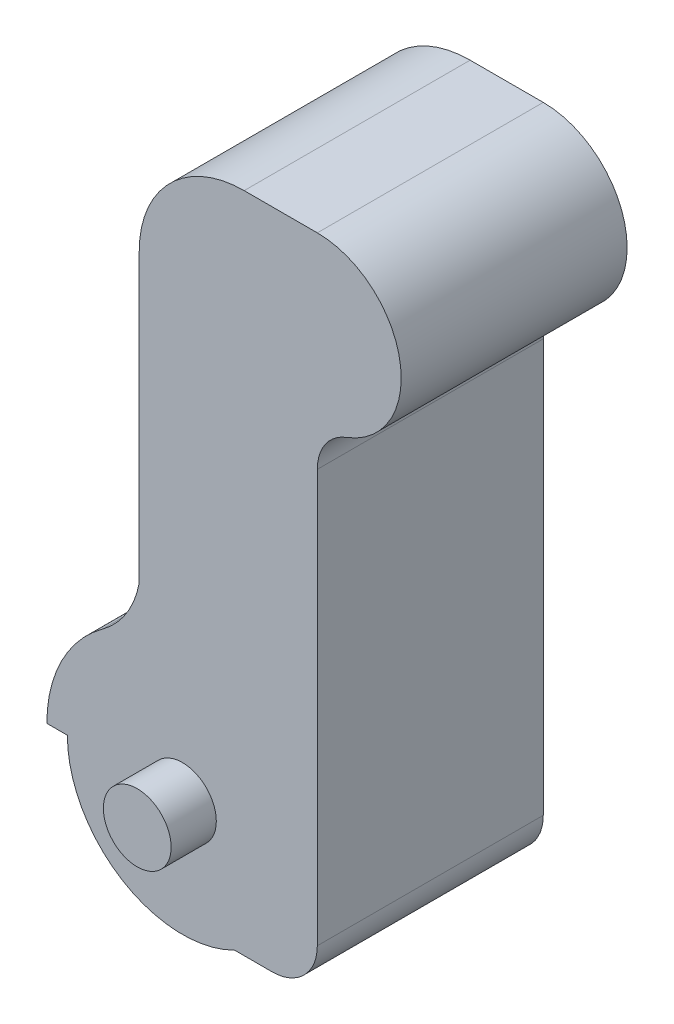
ISO-10303-21;
HEADER;
FILE_DESCRIPTION(('STEP AP214'),'2;1');
FILE_NAME('part.step','',(''),(''),'','','');
FILE_SCHEMA(('AUTOMOTIVE_DESIGN { 1 0 10303 214 1 1 1 1 }'));
ENDSEC;
DATA;
#1=APPLICATION_CONTEXT('core data for automotive mechanical design processes');
#2=APPLICATION_PROTOCOL_DEFINITION('international standard','automotive_design',2000,#1);
#3=PRODUCT_CONTEXT('',#1,'mechanical');
#4=PRODUCT('Part','Part','',(#3));
#5=PRODUCT_RELATED_PRODUCT_CATEGORY('part','',(#4));
#6=PRODUCT_DEFINITION_FORMATION('','',#4);
#7=PRODUCT_DEFINITION_CONTEXT('part definition',#1,'design');
#8=PRODUCT_DEFINITION('design','',#6,#7);
#9=PRODUCT_DEFINITION_SHAPE('','',#8);
#10=(LENGTH_UNIT() NAMED_UNIT(*) SI_UNIT(.MILLI.,.METRE.));
#11=(NAMED_UNIT(*) PLANE_ANGLE_UNIT() SI_UNIT($,.RADIAN.));
#12=(NAMED_UNIT(*) SI_UNIT($,.STERADIAN.) SOLID_ANGLE_UNIT());
#13=UNCERTAINTY_MEASURE_WITH_UNIT(LENGTH_MEASURE(1.E-05),#10,'distance_accuracy_value','');
#14=(GEOMETRIC_REPRESENTATION_CONTEXT(3) GLOBAL_UNCERTAINTY_ASSIGNED_CONTEXT((#13)) GLOBAL_UNIT_ASSIGNED_CONTEXT((#10,
#11,#12)) REPRESENTATION_CONTEXT('',''));
#15=CARTESIAN_POINT('',(0.,0.,0.));
#16=DIRECTION('',(0.,0.,1.));
#17=DIRECTION('',(1.,0.,0.));
#18=AXIS2_PLACEMENT_3D('',#15,#16,#17);
#19=CARTESIAN_POINT('',(13.7663728409148,-12.4324964955587,10.));
#20=DIRECTION('',(0.,0.,-1.));
#21=DIRECTION('',(-1.,0.,0.));
#22=AXIS2_PLACEMENT_3D('',#19,#20,#21);
#23=CYLINDRICAL_SURFACE('',#22,2.);
#24=CARTESIAN_POINT('',(13.7663728409148,-12.4324964955587,0.));
#25=DIRECTION('',(0.,0.,1.));
#26=DIRECTION('',(-1.,0.,0.));
#27=AXIS2_PLACEMENT_3D('',#24,#25,#26);
#28=CIRCLE('',#27,2.);
#29=CARTESIAN_POINT('',(13.7663728408997,-14.4324964955587,0.));
#30=VERTEX_POINT('',#29);
#31=CARTESIAN_POINT('',(15.7663728409148,-12.4324964955587,0.));
#32=VERTEX_POINT('',#31);
#33=EDGE_CURVE('E154',#30,#32,#28,.T.);
#34=ORIENTED_EDGE('',*,*,#33,.T.);
#35=DIRECTION('',(0.,0.,-1.));
#36=VECTOR('',#35,1.);
#37=CARTESIAN_POINT('',(15.7663728409148,-12.4324964955587,10.));
#38=LINE('',#37,#36);
#39=CARTESIAN_POINT('',(15.7663728409148,-12.4324964955587,10.));
#40=VERTEX_POINT('',#39);
#41=EDGE_CURVE('E35',#40,#32,#38,.T.);
#42=ORIENTED_EDGE('',*,*,#41,.F.);
#43=CARTESIAN_POINT('',(13.7663728409148,-12.4324964955587,10.));
#44=DIRECTION('',(0.,0.,1.));
#45=DIRECTION('',(-1.,0.,0.));
#46=AXIS2_PLACEMENT_3D('',#43,#44,#45);
#47=CIRCLE('',#46,2.);
#48=CARTESIAN_POINT('',(13.7663728408997,-14.4324964955587,10.));
#49=VERTEX_POINT('',#48);
#50=EDGE_CURVE('E177',#49,#40,#47,.T.);
#51=ORIENTED_EDGE('',*,*,#50,.F.);
#52=DIRECTION('',(0.,0.,-1.));
#53=VECTOR('',#52,1.);
#54=CARTESIAN_POINT('',(13.7663728408997,-14.4324964955587,10.));
#55=LINE('',#54,#53);
#56=EDGE_CURVE('E150',#49,#30,#55,.T.);
#57=ORIENTED_EDGE('',*,*,#56,.T.);
#58=EDGE_LOOP('',(#34,#42,#51,#57));
#59=FACE_BOUND('',#58,.T.);
#60=ADVANCED_FACE('F32',(#59),#23,.T.);
#61=CARTESIAN_POINT('',(15.7663728409148,5.8287976160783,10.));
#62=DIRECTION('',(-1.,0.,0.));
#63=DIRECTION('',(0.,0.,1.));
#64=AXIS2_PLACEMENT_3D('',#61,#62,#63);
#65=PLANE('',#64);
#66=DIRECTION('',(0.,1.,0.));
#67=VECTOR('',#66,1.);
#68=CARTESIAN_POINT('',(15.7663728409148,5.8287976160783,0.));
#69=LINE('',#68,#67);
#70=CARTESIAN_POINT('',(15.7663728409148,5.8287976160783,0.));
#71=VERTEX_POINT('',#70);
#72=EDGE_CURVE('E157',#32,#71,#69,.T.);
#73=ORIENTED_EDGE('',*,*,#72,.T.);
#74=DIRECTION('',(0.,0.,-1.));
#75=VECTOR('',#74,1.);
#76=CARTESIAN_POINT('',(15.7663728409148,5.8287976160783,10.));
#77=LINE('',#76,#75);
#78=CARTESIAN_POINT('',(15.7663728409148,5.8287976160783,10.));
#79=VERTEX_POINT('',#78);
#80=EDGE_CURVE('E198',#79,#71,#77,.T.);
#81=ORIENTED_EDGE('',*,*,#80,.F.);
#82=DIRECTION('',(0.,1.,0.));
#83=VECTOR('',#82,1.);
#84=CARTESIAN_POINT('',(15.7663728409148,5.8287976160783,10.));
#85=LINE('',#84,#83);
#86=EDGE_CURVE('E105',#40,#79,#85,.T.);
#87=ORIENTED_EDGE('',*,*,#86,.F.);
#88=ORIENTED_EDGE('',*,*,#41,.T.);
#89=EDGE_LOOP('',(#73,#81,#87,#88));
#90=FACE_BOUND('',#89,.T.);
#91=ADVANCED_FACE('F204',(#90),#65,.F.);
#92=CARTESIAN_POINT('',(17.7663728409148,5.8287976160783,10.));
#93=DIRECTION('',(0.,0.,-1.));
#94=DIRECTION('',(-1.,0.,0.));
#95=AXIS2_PLACEMENT_3D('',#92,#93,#94);
#96=CYLINDRICAL_SURFACE('',#95,2.);
#97=CARTESIAN_POINT('',(17.7663728409148,5.8287976160783,0.));
#98=DIRECTION('',(0.,0.,-1.));
#99=DIRECTION('',(-1.,0.,0.));
#100=AXIS2_PLACEMENT_3D('',#97,#98,#99);
#101=CIRCLE('',#100,2.);
#102=CARTESIAN_POINT('',(17.0662093922473,7.70223593776121,0.));
#103=VERTEX_POINT('',#102);
#104=EDGE_CURVE('E160',#71,#103,#101,.T.);
#105=ORIENTED_EDGE('',*,*,#104,.T.);
#106=DIRECTION('',(0.,0.,-1.));
#107=VECTOR('',#106,1.);
#108=CARTESIAN_POINT('',(17.0662093922473,7.70223593776121,10.));
#109=LINE('',#108,#107);
#110=CARTESIAN_POINT('',(17.0662093922473,7.70223593776121,10.));
#111=VERTEX_POINT('',#110);
#112=EDGE_CURVE('E196',#111,#103,#109,.T.);
#113=ORIENTED_EDGE('',*,*,#112,.F.);
#114=CARTESIAN_POINT('',(17.7663728409148,5.8287976160783,10.));
#115=DIRECTION('',(0.,0.,-1.));
#116=DIRECTION('',(-1.,0.,0.));
#117=AXIS2_PLACEMENT_3D('',#114,#115,#116);
#118=CIRCLE('',#117,2.);
#119=EDGE_CURVE('E221',#79,#111,#118,.T.);
#120=ORIENTED_EDGE('',*,*,#119,.F.);
#121=ORIENTED_EDGE('',*,*,#80,.T.);
#122=EDGE_LOOP('',(#105,#113,#120,#121));
#123=FACE_BOUND('',#122,.T.);
#124=ADVANCED_FACE('F213',(#123),#96,.F.);
#125=CARTESIAN_POINT('',(15.7663728409148,11.1802289861344,10.));
#126=DIRECTION('',(0.,0.,-1.));
#127=DIRECTION('',(-1.,0.,0.));
#128=AXIS2_PLACEMENT_3D('',#125,#126,#127);
#129=CYLINDRICAL_SURFACE('',#128,3.71295175092708);
#130=CARTESIAN_POINT('',(15.7663728409148,11.1802289861344,0.));
#131=DIRECTION('',(0.,0.,1.));
#132=DIRECTION('',(1.,0.,0.));
#133=AXIS2_PLACEMENT_3D('',#130,#131,#132);
#134=CIRCLE('',#133,3.71295175092708);
#135=CARTESIAN_POINT('',(15.7663728409148,14.8931807370615,0.));
#136=VERTEX_POINT('',#135);
#137=EDGE_CURVE('E162',#103,#136,#134,.T.);
#138=ORIENTED_EDGE('',*,*,#137,.T.);
#139=DIRECTION('',(0.,0.,-1.));
#140=VECTOR('',#139,1.);
#141=CARTESIAN_POINT('',(15.7663728409148,14.8931807370615,10.));
#142=LINE('',#141,#140);
#143=CARTESIAN_POINT('',(15.7663728409148,14.8931807370615,10.));
#144=VERTEX_POINT('',#143);
#145=EDGE_CURVE('E193',#144,#136,#142,.T.);
#146=ORIENTED_EDGE('',*,*,#145,.F.);
#147=CARTESIAN_POINT('',(15.7663728409148,11.1802289861344,10.));
#148=DIRECTION('',(0.,0.,1.));
#149=DIRECTION('',(1.,0.,0.));
#150=AXIS2_PLACEMENT_3D('',#147,#148,#149);
#151=CIRCLE('',#150,3.71295175092708);
#152=EDGE_CURVE('E218',#111,#144,#151,.T.);
#153=ORIENTED_EDGE('',*,*,#152,.F.);
#154=ORIENTED_EDGE('',*,*,#112,.T.);
#155=EDGE_LOOP('',(#138,#146,#153,#154));
#156=FACE_BOUND('',#155,.T.);
#157=ADVANCED_FACE('F216',(#156),#129,.T.);
#158=CARTESIAN_POINT('',(12.5296858435319,14.8931807370615,10.));
#159=DIRECTION('',(0.,-1.,0.));
#160=DIRECTION('',(0.,0.,-1.));
#161=AXIS2_PLACEMENT_3D('',#158,#159,#160);
#162=PLANE('',#161);
#163=DIRECTION('',(-1.,0.,0.));
#164=VECTOR('',#163,1.);
#165=CARTESIAN_POINT('',(12.5296858435319,14.8931807370615,0.));
#166=LINE('',#165,#164);
#167=CARTESIAN_POINT('',(12.5296858435319,14.8931807370615,0.));
#168=VERTEX_POINT('',#167);
#169=EDGE_CURVE('E164',#136,#168,#166,.T.);
#170=ORIENTED_EDGE('',*,*,#169,.T.);
#171=DIRECTION('',(0.,0.,-1.));
#172=VECTOR('',#171,1.);
#173=CARTESIAN_POINT('',(12.5296858435319,14.8931807370615,10.));
#174=LINE('',#173,#172);
#175=CARTESIAN_POINT('',(12.5296858435319,14.8931807370615,10.));
#176=VERTEX_POINT('',#175);
#177=EDGE_CURVE('E190',#176,#168,#174,.T.);
#178=ORIENTED_EDGE('',*,*,#177,.F.);
#179=DIRECTION('',(-1.,0.,0.));
#180=VECTOR('',#179,1.);
#181=CARTESIAN_POINT('',(12.5296858435319,14.8931807370615,10.));
#182=LINE('',#181,#180);
#183=EDGE_CURVE('E220',#144,#176,#182,.T.);
#184=ORIENTED_EDGE('',*,*,#183,.F.);
#185=ORIENTED_EDGE('',*,*,#145,.T.);
#186=EDGE_LOOP('',(#170,#178,#184,#185));
#187=FACE_BOUND('',#186,.T.);
#188=ADVANCED_FACE('F252',(#187),#162,.F.);
#189=CARTESIAN_POINT('',(12.5296858435319,10.2484574219375,10.));
#190=DIRECTION('',(0.,0.,-1.));
#191=DIRECTION('',(-1.,0.,0.));
#192=AXIS2_PLACEMENT_3D('',#189,#190,#191);
#193=CYLINDRICAL_SURFACE('',#192,4.64472331512404);
#194=CARTESIAN_POINT('',(12.5296858435319,10.2484574219375,0.));
#195=DIRECTION('',(0.,0.,1.));
#196=DIRECTION('',(-1.,0.,0.));
#197=AXIS2_PLACEMENT_3D('',#194,#195,#196);
#198=CIRCLE('',#197,4.64472331512404);
#199=CARTESIAN_POINT('',(7.88496252840787,10.2484574219375,0.));
#200=VERTEX_POINT('',#199);
#201=EDGE_CURVE('E166',#168,#200,#198,.T.);
#202=ORIENTED_EDGE('',*,*,#201,.T.);
#203=DIRECTION('',(0.,0.,-1.));
#204=VECTOR('',#203,1.);
#205=CARTESIAN_POINT('',(7.88496252840787,10.2484574219375,10.));
#206=LINE('',#205,#204);
#207=CARTESIAN_POINT('',(7.88496252840787,10.2484574219375,10.));
#208=VERTEX_POINT('',#207);
#209=EDGE_CURVE('E187',#208,#200,#206,.T.);
#210=ORIENTED_EDGE('',*,*,#209,.F.);
#211=CARTESIAN_POINT('',(12.5296858435319,10.2484574219375,10.));
#212=DIRECTION('',(0.,0.,1.));
#213=DIRECTION('',(-1.,0.,0.));
#214=AXIS2_PLACEMENT_3D('',#211,#212,#213);
#215=CIRCLE('',#214,4.64472331512404);
#216=EDGE_CURVE('E223',#176,#208,#215,.T.);
#217=ORIENTED_EDGE('',*,*,#216,.F.);
#218=ORIENTED_EDGE('',*,*,#177,.T.);
#219=EDGE_LOOP('',(#202,#210,#217,#218));
#220=FACE_BOUND('',#219,.T.);
#221=ADVANCED_FACE('F249',(#220),#193,.T.);
#222=CARTESIAN_POINT('',(7.88496252840787,10.2484574219375,10.));
#223=DIRECTION('',(1.,0.,0.));
#224=DIRECTION('',(0.,0.,-1.));
#225=AXIS2_PLACEMENT_3D('',#222,#223,#224);
#226=PLANE('',#225);
#227=DIRECTION('',(0.,-1.,0.));
#228=VECTOR('',#227,1.);
#229=CARTESIAN_POINT('',(7.88496252840787,10.2484574219375,0.));
#230=LINE('',#229,#228);
#231=CARTESIAN_POINT('',(7.88496252840787,-2.47168719683717,0.));
#232=VERTEX_POINT('',#231);
#233=EDGE_CURVE('E168',#200,#232,#230,.T.);
#234=ORIENTED_EDGE('',*,*,#233,.T.);
#235=DIRECTION('',(0.,0.,-1.));
#236=VECTOR('',#235,1.);
#237=CARTESIAN_POINT('',(7.88496252840787,-2.47168719683717,10.));
#238=LINE('',#237,#236);
#239=CARTESIAN_POINT('',(7.88496252840787,-2.47168719683717,10.));
#240=VERTEX_POINT('',#239);
#241=EDGE_CURVE('E184',#240,#232,#238,.T.);
#242=ORIENTED_EDGE('',*,*,#241,.F.);
#243=DIRECTION('',(0.,-1.,0.));
#244=VECTOR('',#243,1.);
#245=CARTESIAN_POINT('',(7.88496252840787,10.2484574219375,10.));
#246=LINE('',#245,#244);
#247=EDGE_CURVE('E229',#208,#240,#246,.T.);
#248=ORIENTED_EDGE('',*,*,#247,.F.);
#249=ORIENTED_EDGE('',*,*,#209,.T.);
#250=EDGE_LOOP('',(#234,#242,#248,#249));
#251=FACE_BOUND('',#250,.T.);
#252=ADVANCED_FACE('F245',(#251),#226,.F.);
#253=CARTESIAN_POINT('',(3.82388040438476,-1.70957677084109,10.));
#254=DIRECTION('',(0.,0.,-1.));
#255=DIRECTION('',(-1.,0.,0.));
#256=AXIS2_PLACEMENT_3D('',#253,#254,#255);
#257=CYLINDRICAL_SURFACE('',#256,4.13197293305171);
#258=CARTESIAN_POINT('',(3.82388040438476,-1.70957677084109,0.));
#259=DIRECTION('',(0.,0.,-1.));
#260=DIRECTION('',(1.,0.,0.));
#261=AXIS2_PLACEMENT_3D('',#258,#259,#260);
#262=CIRCLE('',#261,4.13197293305171);
#263=CARTESIAN_POINT('',(6.2594596346327,-5.04741351529951,0.));
#264=VERTEX_POINT('',#263);
#265=EDGE_CURVE('E170',#232,#264,#262,.T.);
#266=ORIENTED_EDGE('',*,*,#265,.T.);
#267=DIRECTION('',(0.,0.,-1.));
#268=VECTOR('',#267,1.);
#269=CARTESIAN_POINT('',(6.2594596346327,-5.04741351529951,10.));
#270=LINE('',#269,#268);
#271=CARTESIAN_POINT('',(6.2594596346327,-5.04741351529951,10.));
#272=VERTEX_POINT('',#271);
#273=EDGE_CURVE('E181',#272,#264,#270,.T.);
#274=ORIENTED_EDGE('',*,*,#273,.F.);
#275=CARTESIAN_POINT('',(3.82388040438476,-1.70957677084109,10.));
#276=DIRECTION('',(0.,0.,-1.));
#277=DIRECTION('',(1.,0.,0.));
#278=AXIS2_PLACEMENT_3D('',#275,#276,#277);
#279=CIRCLE('',#278,4.13197293305171);
#280=EDGE_CURVE('E231',#240,#272,#279,.T.);
#281=ORIENTED_EDGE('',*,*,#280,.F.);
#282=ORIENTED_EDGE('',*,*,#241,.T.);
#283=EDGE_LOOP('',(#266,#274,#281,#282));
#284=FACE_BOUND('',#283,.T.);
#285=ADVANCED_FACE('F237',(#284),#257,.F.);
#286=CARTESIAN_POINT('',(9.79614189714082,-9.89425563920457,10.));
#287=DIRECTION('',(0.,0.,-1.));
#288=DIRECTION('',(-1.,0.,0.));
#289=AXIS2_PLACEMENT_3D('',#286,#287,#288);
#290=CYLINDRICAL_SURFACE('',#289,6.);
#291=CARTESIAN_POINT('',(9.79614189714082,-9.89425563920457,0.));
#292=DIRECTION('',(0.,0.,1.));
#293=DIRECTION('',(1.,0.,0.));
#294=AXIS2_PLACEMENT_3D('',#291,#292,#293);
#295=CIRCLE('',#294,6.);
#296=CARTESIAN_POINT('',(3.79614189714082,-9.89425563920457,0.));
#297=VERTEX_POINT('',#296);
#298=EDGE_CURVE('E172',#264,#297,#295,.T.);
#299=ORIENTED_EDGE('',*,*,#298,.T.);
#300=DIRECTION('',(0.,0.,-1.));
#301=VECTOR('',#300,1.);
#302=CARTESIAN_POINT('',(3.79614189714082,-9.89425563920457,10.));
#303=LINE('',#302,#301);
#304=CARTESIAN_POINT('',(3.79614189714082,-9.89425563920457,10.));
#305=VERTEX_POINT('',#304);
#306=EDGE_CURVE('E145',#305,#297,#303,.T.);
#307=ORIENTED_EDGE('',*,*,#306,.F.);
#308=CARTESIAN_POINT('',(9.79614189714082,-9.89425563920457,10.));
#309=DIRECTION('',(0.,0.,1.));
#310=DIRECTION('',(1.,0.,0.));
#311=AXIS2_PLACEMENT_3D('',#308,#309,#310);
#312=CIRCLE('',#311,6.);
#313=EDGE_CURVE('E136',#272,#305,#312,.T.);
#314=ORIENTED_EDGE('',*,*,#313,.F.);
#315=ORIENTED_EDGE('',*,*,#273,.T.);
#316=EDGE_LOOP('',(#299,#307,#314,#315));
#317=FACE_BOUND('',#316,.T.);
#318=ADVANCED_FACE('F241',(#317),#290,.T.);
#319=CARTESIAN_POINT('',(3.79614189714082,-9.89425563920457,10.));
#320=DIRECTION('',(0.,1.,0.));
#321=DIRECTION('',(-1.,0.,0.));
#322=AXIS2_PLACEMENT_3D('',#319,#320,#321);
#323=PLANE('',#322);
#324=DIRECTION('',(1.,0.,0.));
#325=VECTOR('',#324,1.);
#326=CARTESIAN_POINT('',(3.79614189714082,-9.89425563920457,0.));
#327=LINE('',#326,#325);
#328=CARTESIAN_POINT('',(4.70457442014162,-9.89425563920457,0.));
#329=VERTEX_POINT('',#328);
#330=EDGE_CURVE('E144',#297,#329,#327,.T.);
#331=ORIENTED_EDGE('',*,*,#330,.T.);
#332=DIRECTION('',(0.,0.,-1.));
#333=VECTOR('',#332,1.);
#334=CARTESIAN_POINT('',(4.70457442014162,-9.89425563920457,10.));
#335=LINE('',#334,#333);
#336=CARTESIAN_POINT('',(4.70457442014162,-9.89425563920457,10.));
#337=VERTEX_POINT('',#336);
#338=EDGE_CURVE('E141',#337,#329,#335,.T.);
#339=ORIENTED_EDGE('',*,*,#338,.F.);
#340=DIRECTION('',(1.,0.,0.));
#341=VECTOR('',#340,1.);
#342=CARTESIAN_POINT('',(3.79614189714082,-9.89425563920457,10.));
#343=LINE('',#342,#341);
#344=EDGE_CURVE('E130',#305,#337,#343,.T.);
#345=ORIENTED_EDGE('',*,*,#344,.F.);
#346=ORIENTED_EDGE('',*,*,#306,.T.);
#347=EDGE_LOOP('',(#331,#339,#345,#346));
#348=FACE_BOUND('',#347,.T.);
#349=ADVANCED_FACE('F142',(#348),#323,.F.);
#350=CARTESIAN_POINT('',(9.79614189714082,-9.89425563920457,10.));
#351=DIRECTION('',(0.,0.,-1.));
#352=DIRECTION('',(-1.,0.,0.));
#353=AXIS2_PLACEMENT_3D('',#350,#351,#352);
#354=CYLINDRICAL_SURFACE('',#353,5.0915674769992);
#355=CARTESIAN_POINT('',(9.79614189714082,-9.89425563920457,0.));
#356=DIRECTION('',(0.,0.,1.));
#357=DIRECTION('',(1.,0.,0.));
#358=AXIS2_PLACEMENT_3D('',#355,#356,#357);
#359=CIRCLE('',#358,5.0915674769992);
#360=CARTESIAN_POINT('',(12.1044809759304,-14.4324964955462,0.));
#361=VERTEX_POINT('',#360);
#362=EDGE_CURVE('E90',#329,#361,#359,.T.);
#363=ORIENTED_EDGE('',*,*,#362,.T.);
#364=DIRECTION('',(0.,0.,-1.));
#365=VECTOR('',#364,1.);
#366=CARTESIAN_POINT('',(12.1044809759304,-14.4324964955462,10.));
#367=LINE('',#366,#365);
#368=CARTESIAN_POINT('',(12.1044809759304,-14.4324964955462,10.));
#369=VERTEX_POINT('',#368);
#370=EDGE_CURVE('E146',#369,#361,#367,.T.);
#371=ORIENTED_EDGE('',*,*,#370,.F.);
#372=CARTESIAN_POINT('',(9.79614189714082,-9.89425563920457,10.));
#373=DIRECTION('',(0.,0.,1.));
#374=DIRECTION('',(1.,0.,0.));
#375=AXIS2_PLACEMENT_3D('',#372,#373,#374);
#376=CIRCLE('',#375,5.0915674769992);
#377=EDGE_CURVE('E134',#337,#369,#376,.T.);
#378=ORIENTED_EDGE('',*,*,#377,.F.);
#379=ORIENTED_EDGE('',*,*,#338,.T.);
#380=EDGE_LOOP('',(#363,#371,#378,#379));
#381=FACE_BOUND('',#380,.T.);
#382=ADVANCED_FACE('F148',(#381),#354,.T.);
#383=CARTESIAN_POINT('',(13.7663728408997,-14.4324964955587,10.));
#384=DIRECTION('',(7.5165803586984E-12,1.,0.));
#385=DIRECTION('',(-1.,7.5165803586984E-12,0.));
#386=AXIS2_PLACEMENT_3D('',#383,#384,#385);
#387=PLANE('',#386);
#388=DIRECTION('',(1.,-7.5165803586984E-12,0.));
#389=VECTOR('',#388,1.);
#390=CARTESIAN_POINT('',(13.7663728408997,-14.4324964955587,0.));
#391=LINE('',#390,#389);
#392=EDGE_CURVE('E96',#361,#30,#391,.T.);
#393=ORIENTED_EDGE('',*,*,#392,.T.);
#394=ORIENTED_EDGE('',*,*,#56,.F.);
#395=DIRECTION('',(1.,-7.5165803586984E-12,0.));
#396=VECTOR('',#395,1.);
#397=CARTESIAN_POINT('',(13.7663728408997,-14.4324964955587,10.));
#398=LINE('',#397,#396);
#399=EDGE_CURVE('E49',#369,#49,#398,.T.);
#400=ORIENTED_EDGE('',*,*,#399,.F.);
#401=ORIENTED_EDGE('',*,*,#370,.T.);
#402=EDGE_LOOP('',(#393,#394,#400,#401));
#403=FACE_BOUND('',#402,.T.);
#404=ADVANCED_FACE('F326',(#403),#387,.F.);
#405=CARTESIAN_POINT('',(13.7663728409148,-12.4324964955587,10.));
#406=DIRECTION('',(0.,0.,-1.));
#407=DIRECTION('',(-1.,0.,0.));
#408=AXIS2_PLACEMENT_3D('',#405,#406,#407);
#409=PLANE('',#408);
#410=CARTESIAN_POINT('',(9.79614189714082,-9.89425563920457,10.));
#411=DIRECTION('',(0.,0.,1.));
#412=DIRECTION('',(1.,0.,0.));
#413=AXIS2_PLACEMENT_3D('',#410,#411,#412);
#414=CIRCLE('',#413,1.5);
#415=CARTESIAN_POINT('',(11.2961418971408,-9.89425563920457,10.));
#416=VERTEX_POINT('',#415);
#417=EDGE_CURVE('E11',#416,#416,#414,.T.);
#418=ORIENTED_EDGE('',*,*,#417,.F.);
#419=EDGE_LOOP('',(#418));
#420=FACE_BOUND('',#419,.T.);
#421=ORIENTED_EDGE('',*,*,#50,.T.);
#422=ORIENTED_EDGE('',*,*,#86,.T.);
#423=ORIENTED_EDGE('',*,*,#119,.T.);
#424=ORIENTED_EDGE('',*,*,#152,.T.);
#425=ORIENTED_EDGE('',*,*,#183,.T.);
#426=ORIENTED_EDGE('',*,*,#216,.T.);
#427=ORIENTED_EDGE('',*,*,#247,.T.);
#428=ORIENTED_EDGE('',*,*,#280,.T.);
#429=ORIENTED_EDGE('',*,*,#313,.T.);
#430=ORIENTED_EDGE('',*,*,#344,.T.);
#431=ORIENTED_EDGE('',*,*,#377,.T.);
#432=ORIENTED_EDGE('',*,*,#399,.T.);
#433=EDGE_LOOP('',(#421,#422,#423,#424,#425,#426,#427,#428,#429,#430,#431,#432));
#434=FACE_BOUND('',#433,.T.);
#435=ADVANCED_FACE('F132',(#420,#434),#409,.F.);
#436=CARTESIAN_POINT('',(13.7663728409148,-12.4324964955587,0.));
#437=DIRECTION('',(0.,0.,-1.));
#438=DIRECTION('',(-1.,0.,0.));
#439=AXIS2_PLACEMENT_3D('',#436,#437,#438);
#440=PLANE('',#439);
#441=ORIENTED_EDGE('',*,*,#33,.F.);
#442=ORIENTED_EDGE('',*,*,#392,.F.);
#443=ORIENTED_EDGE('',*,*,#362,.F.);
#444=ORIENTED_EDGE('',*,*,#330,.F.);
#445=ORIENTED_EDGE('',*,*,#298,.F.);
#446=ORIENTED_EDGE('',*,*,#265,.F.);
#447=ORIENTED_EDGE('',*,*,#233,.F.);
#448=ORIENTED_EDGE('',*,*,#201,.F.);
#449=ORIENTED_EDGE('',*,*,#169,.F.);
#450=ORIENTED_EDGE('',*,*,#137,.F.);
#451=ORIENTED_EDGE('',*,*,#104,.F.);
#452=ORIENTED_EDGE('',*,*,#72,.F.);
#453=EDGE_LOOP('',(#441,#442,#443,#444,#445,#446,#447,#448,#449,#450,#451,#452));
#454=FACE_BOUND('',#453,.T.);
#455=ADVANCED_FACE('F209',(#454),#440,.T.);
#456=CARTESIAN_POINT('',(9.79614189714082,-9.89425563920457,12.));
#457=DIRECTION('',(0.,0.,-1.));
#458=DIRECTION('',(-1.,0.,0.));
#459=AXIS2_PLACEMENT_3D('',#456,#457,#458);
#460=CYLINDRICAL_SURFACE('',#459,1.5);
#461=CARTESIAN_POINT('',(9.79614189714082,-9.89425563920457,12.));
#462=DIRECTION('',(0.,0.,1.));
#463=DIRECTION('',(1.,0.,0.));
#464=AXIS2_PLACEMENT_3D('',#461,#462,#463);
#465=CIRCLE('',#464,1.5);
#466=CARTESIAN_POINT('',(11.2961418971408,-9.89425563920457,12.));
#467=VERTEX_POINT('',#466);
#468=EDGE_CURVE('E158',#467,#467,#465,.T.);
#469=ORIENTED_EDGE('',*,*,#468,.F.);
#470=EDGE_LOOP('',(#469));
#471=FACE_BOUND('',#470,.T.);
#472=ORIENTED_EDGE('',*,*,#417,.T.);
#473=EDGE_LOOP('',(#472));
#474=FACE_BOUND('',#473,.T.);
#475=ADVANCED_FACE('F345',(#471,#474),#460,.T.);
#476=CARTESIAN_POINT('',(9.79614189714082,-9.89425563920457,12.));
#477=DIRECTION('',(0.,0.,1.));
#478=DIRECTION('',(1.,0.,0.));
#479=AXIS2_PLACEMENT_3D('',#476,#477,#478);
#480=PLANE('',#479);
#481=ORIENTED_EDGE('',*,*,#468,.T.);
#482=EDGE_LOOP('',(#481));
#483=FACE_BOUND('',#482,.T.);
#484=ADVANCED_FACE('F361',(#483),#480,.T.);
#485=CLOSED_SHELL('',(#60,#91,#124,#157,#188,#221,#252,#285,#318,#349,#382,#404,#435,#455,#475,#484));
#486=MANIFOLD_SOLID_BREP('B2',#485);
#487=ADVANCED_BREP_SHAPE_REPRESENTATION('',(#18,#486),#14);
#488=SHAPE_DEFINITION_REPRESENTATION(#9,#487);
ENDSEC;
END-ISO-10303-21;
